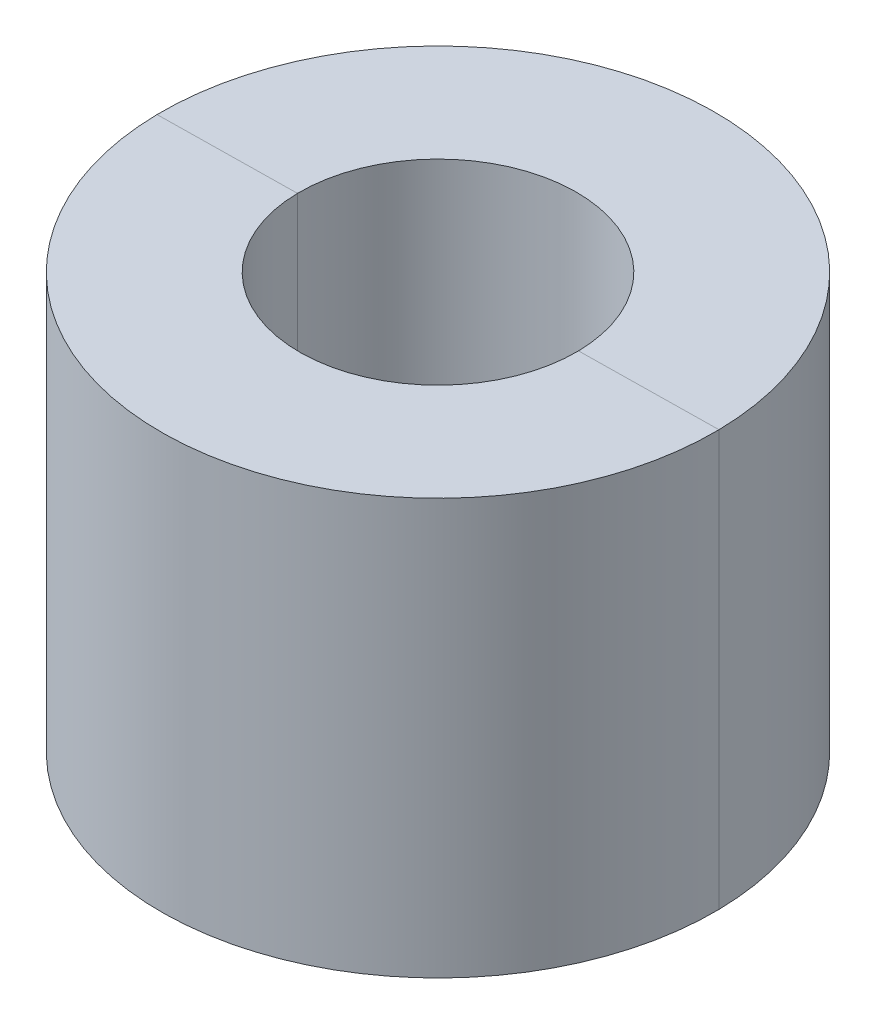
ISO-10303-21;
HEADER;
FILE_DESCRIPTION(('STEP AP214'),'2;1');
FILE_NAME('part.step','',(''),(''),'','','');
FILE_SCHEMA(('AUTOMOTIVE_DESIGN { 1 0 10303 214 1 1 1 1 }'));
ENDSEC;
DATA;
#1=APPLICATION_CONTEXT('core data for automotive mechanical design processes');
#2=APPLICATION_PROTOCOL_DEFINITION('international standard','automotive_design',2000,#1);
#3=PRODUCT_CONTEXT('',#1,'mechanical');
#4=PRODUCT('Part','Part','',(#3));
#5=PRODUCT_RELATED_PRODUCT_CATEGORY('part','',(#4));
#6=PRODUCT_DEFINITION_FORMATION('','',#4);
#7=PRODUCT_DEFINITION_CONTEXT('part definition',#1,'design');
#8=PRODUCT_DEFINITION('design','',#6,#7);
#9=PRODUCT_DEFINITION_SHAPE('','',#8);
#10=(LENGTH_UNIT() NAMED_UNIT(*) SI_UNIT(.MILLI.,.METRE.));
#11=(NAMED_UNIT(*) PLANE_ANGLE_UNIT() SI_UNIT($,.RADIAN.));
#12=(NAMED_UNIT(*) SI_UNIT($,.STERADIAN.) SOLID_ANGLE_UNIT());
#13=UNCERTAINTY_MEASURE_WITH_UNIT(LENGTH_MEASURE(1.E-05),#10,'distance_accuracy_value','');
#14=(GEOMETRIC_REPRESENTATION_CONTEXT(3) GLOBAL_UNCERTAINTY_ASSIGNED_CONTEXT((#13)) GLOBAL_UNIT_ASSIGNED_CONTEXT((#10,
#11,#12)) REPRESENTATION_CONTEXT('',''));
#15=CARTESIAN_POINT('',(0.,0.,0.));
#16=DIRECTION('',(0.,0.,1.));
#17=DIRECTION('',(1.,0.,0.));
#18=AXIS2_PLACEMENT_3D('',#15,#16,#17);
#19=CARTESIAN_POINT('',(-26.5125846974702,-0.00999999999999959,0.38639417159978));
#20=DIRECTION('',(0.0145724435112044,0.,0.999893816307568));
#21=DIRECTION('',(0.999893816307568,0.,-0.0145724435112044));
#22=AXIS2_PLACEMENT_3D('',#19,#20,#21);
#23=PLANE('',#22);
#24=DIRECTION('',(0.999893816307568,0.,-0.0145724435112044));
#25=VECTOR('',#24,1.);
#26=CARTESIAN_POINT('',(0.,30.,0.));
#27=LINE('',#26,#25);
#28=CARTESIAN_POINT('',(-19.9978763261514,30.,0.291448870224088));
#29=VERTEX_POINT('',#28);
#30=CARTESIAN_POINT('',(-9.99893816307568,30.,0.145724435112044));
#31=VERTEX_POINT('',#30);
#32=EDGE_CURVE('E110',#29,#31,#27,.T.);
#33=ORIENTED_EDGE('',*,*,#32,.F.);
#34=DIRECTION('',(0.,-1.,0.));
#35=VECTOR('',#34,1.);
#36=CARTESIAN_POINT('',(-19.9978763261514,30.,0.291448870224087));
#37=LINE('',#36,#35);
#38=CARTESIAN_POINT('',(-19.9978763261514,0.,0.291448870224088));
#39=VERTEX_POINT('',#38);
#40=EDGE_CURVE('E102',#29,#39,#37,.T.);
#41=ORIENTED_EDGE('',*,*,#40,.T.);
#42=DIRECTION('',(0.999893816307568,0.,-0.0145724435112044));
#43=VECTOR('',#42,1.);
#44=CARTESIAN_POINT('',(0.,0.,0.));
#45=LINE('',#44,#43);
#46=CARTESIAN_POINT('',(-9.99893816307568,0.,0.145724435112044));
#47=VERTEX_POINT('',#46);
#48=EDGE_CURVE('E122',#39,#47,#45,.T.);
#49=ORIENTED_EDGE('',*,*,#48,.T.);
#50=DIRECTION('',(0.,-1.,0.));
#51=VECTOR('',#50,1.);
#52=CARTESIAN_POINT('',(-9.99893816307568,30.,0.145724435112044));
#53=LINE('',#52,#51);
#54=EDGE_CURVE('E76',#31,#47,#53,.T.);
#55=ORIENTED_EDGE('',*,*,#54,.F.);
#56=EDGE_LOOP('',(#33,#41,#49,#55));
#57=FACE_BOUND('',#56,.T.);
#58=ADVANCED_FACE('F53',(#57),#23,.T.);
#59=CARTESIAN_POINT('',(9.99893816307568,0.,-0.145724435112044));
#60=VERTEX_POINT('',#59);
#61=CARTESIAN_POINT('',(19.9978763261514,0.,-0.291448870224088));
#62=VERTEX_POINT('',#61);
#63=EDGE_CURVE('E115',#60,#62,#45,.T.);
#64=ORIENTED_EDGE('',*,*,#63,.T.);
#65=DIRECTION('',(0.,-1.,0.));
#66=VECTOR('',#65,1.);
#67=CARTESIAN_POINT('',(19.9978763261514,30.,-0.291448870224087));
#68=LINE('',#67,#66);
#69=CARTESIAN_POINT('',(19.9978763261514,30.,-0.291448870224088));
#70=VERTEX_POINT('',#69);
#71=EDGE_CURVE('E100',#62,#70,#68,.F.);
#72=ORIENTED_EDGE('',*,*,#71,.T.);
#73=CARTESIAN_POINT('',(9.99893816307568,30.,-0.145724435112044));
#74=VERTEX_POINT('',#73);
#75=EDGE_CURVE('E107',#74,#70,#27,.T.);
#76=ORIENTED_EDGE('',*,*,#75,.F.);
#77=DIRECTION('',(0.,-1.,0.));
#78=VECTOR('',#77,1.);
#79=CARTESIAN_POINT('',(9.99893816307568,30.,-0.145724435112044));
#80=LINE('',#79,#78);
#81=EDGE_CURVE('E68',#60,#74,#80,.F.);
#82=ORIENTED_EDGE('',*,*,#81,.F.);
#83=EDGE_LOOP('',(#64,#72,#76,#82));
#84=FACE_BOUND('',#83,.T.);
#85=ADVANCED_FACE('F113',(#84),#23,.T.);
#86=CARTESIAN_POINT('',(0.,0.,0.));
#87=DIRECTION('',(0.,1.,0.));
#88=DIRECTION('',(0.,0.,1.));
#89=AXIS2_PLACEMENT_3D('',#86,#87,#88);
#90=PLANE('',#89);
#91=ORIENTED_EDGE('',*,*,#48,.F.);
#92=CARTESIAN_POINT('',(0.,0.,0.));
#93=DIRECTION('',(0.,1.,0.));
#94=DIRECTION('',(0.,0.,1.));
#95=AXIS2_PLACEMENT_3D('',#92,#93,#94);
#96=CIRCLE('',#95,20.);
#97=EDGE_CURVE('E104',#62,#39,#96,.T.);
#98=ORIENTED_EDGE('',*,*,#97,.F.);
#99=ORIENTED_EDGE('',*,*,#63,.F.);
#100=CARTESIAN_POINT('',(0.,0.,0.));
#101=DIRECTION('',(0.,1.,0.));
#102=DIRECTION('',(1.,0.,0.));
#103=AXIS2_PLACEMENT_3D('',#100,#101,#102);
#104=CIRCLE('',#103,10.);
#105=EDGE_CURVE('E13',#60,#47,#104,.T.);
#106=ORIENTED_EDGE('',*,*,#105,.T.);
#107=EDGE_LOOP('',(#91,#98,#99,#106));
#108=FACE_BOUND('',#107,.T.);
#109=ADVANCED_FACE('F124',(#108),#90,.F.);
#110=CARTESIAN_POINT('',(0.,30.,0.));
#111=DIRECTION('',(0.,1.,0.));
#112=DIRECTION('',(0.,0.,1.));
#113=AXIS2_PLACEMENT_3D('',#110,#111,#112);
#114=PLANE('',#113);
#115=CARTESIAN_POINT('',(0.,30.,0.));
#116=DIRECTION('',(0.,1.,0.));
#117=DIRECTION('',(0.,0.,1.));
#118=AXIS2_PLACEMENT_3D('',#115,#116,#117);
#119=CIRCLE('',#118,20.);
#120=EDGE_CURVE('E96',#70,#29,#119,.T.);
#121=ORIENTED_EDGE('',*,*,#120,.T.);
#122=ORIENTED_EDGE('',*,*,#32,.T.);
#123=CARTESIAN_POINT('',(0.,30.,0.));
#124=DIRECTION('',(0.,1.,0.));
#125=DIRECTION('',(1.,0.,0.));
#126=AXIS2_PLACEMENT_3D('',#123,#124,#125);
#127=CIRCLE('',#126,10.);
#128=EDGE_CURVE('E61',#74,#31,#127,.T.);
#129=ORIENTED_EDGE('',*,*,#128,.F.);
#130=ORIENTED_EDGE('',*,*,#75,.T.);
#131=EDGE_LOOP('',(#121,#122,#129,#130));
#132=FACE_BOUND('',#131,.T.);
#133=ADVANCED_FACE('F108',(#132),#114,.T.);
#134=CARTESIAN_POINT('',(0.,30.,0.));
#135=DIRECTION('',(0.,-1.,0.));
#136=DIRECTION('',(0.,0.,-1.));
#137=AXIS2_PLACEMENT_3D('',#134,#135,#136);
#138=CYLINDRICAL_SURFACE('',#137,10.);
#139=ORIENTED_EDGE('',*,*,#128,.T.);
#140=ORIENTED_EDGE('',*,*,#54,.T.);
#141=ORIENTED_EDGE('',*,*,#105,.F.);
#142=ORIENTED_EDGE('',*,*,#81,.T.);
#143=EDGE_LOOP('',(#139,#140,#141,#142));
#144=FACE_BOUND('',#143,.T.);
#145=ADVANCED_FACE('F55',(#144),#138,.F.);
#146=CARTESIAN_POINT('',(0.,30.,0.));
#147=DIRECTION('',(0.,-1.,0.));
#148=DIRECTION('',(0.,0.,-1.));
#149=AXIS2_PLACEMENT_3D('',#146,#147,#148);
#150=CYLINDRICAL_SURFACE('',#149,20.);
#151=ORIENTED_EDGE('',*,*,#40,.F.);
#152=ORIENTED_EDGE('',*,*,#120,.F.);
#153=ORIENTED_EDGE('',*,*,#71,.F.);
#154=ORIENTED_EDGE('',*,*,#97,.T.);
#155=EDGE_LOOP('',(#151,#152,#153,#154));
#156=FACE_BOUND('',#155,.T.);
#157=ADVANCED_FACE('F98',(#156),#150,.T.);
#158=CLOSED_SHELL('',(#58,#85,#109,#133,#145,#157));
#159=MANIFOLD_SOLID_BREP('B2',#158);
#160=CARTESIAN_POINT('',(-26.5125846974702,-0.00999999999999959,0.38639417159978));
#161=DIRECTION('',(0.0145724435112044,0.,0.999893816307568));
#162=DIRECTION('',(0.999893816307568,0.,-0.0145724435112044));
#163=AXIS2_PLACEMENT_3D('',#160,#161,#162);
#164=PLANE('',#163);
#165=DIRECTION('',(0.999893816307568,0.,-0.0145724435112044));
#166=VECTOR('',#165,1.);
#167=CARTESIAN_POINT('',(0.,30.,0.));
#168=LINE('',#167,#166);
#169=CARTESIAN_POINT('',(-19.9978763261514,30.,0.291448870224088));
#170=VERTEX_POINT('',#169);
#171=CARTESIAN_POINT('',(-9.99893816307568,30.,0.145724435112044));
#172=VERTEX_POINT('',#171);
#173=EDGE_CURVE('E227',#170,#172,#168,.T.);
#174=ORIENTED_EDGE('',*,*,#173,.T.);
#175=DIRECTION('',(0.,-1.,0.));
#176=VECTOR('',#175,1.);
#177=CARTESIAN_POINT('',(-9.99893816307568,30.,0.145724435112044));
#178=LINE('',#177,#176);
#179=CARTESIAN_POINT('',(-9.99893816307568,0.,0.145724435112044));
#180=VERTEX_POINT('',#179);
#181=EDGE_CURVE('E182',#172,#180,#178,.T.);
#182=ORIENTED_EDGE('',*,*,#181,.T.);
#183=DIRECTION('',(0.999893816307568,0.,-0.0145724435112044));
#184=VECTOR('',#183,1.);
#185=CARTESIAN_POINT('',(0.,0.,0.));
#186=LINE('',#185,#184);
#187=CARTESIAN_POINT('',(-19.9978763261514,0.,0.291448870224088));
#188=VERTEX_POINT('',#187);
#189=EDGE_CURVE('E239',#188,#180,#186,.T.);
#190=ORIENTED_EDGE('',*,*,#189,.F.);
#191=DIRECTION('',(0.,-1.,0.));
#192=VECTOR('',#191,1.);
#193=CARTESIAN_POINT('',(-19.9978763261514,30.,0.291448870224087));
#194=LINE('',#193,#192);
#195=EDGE_CURVE('E177',#170,#188,#194,.T.);
#196=ORIENTED_EDGE('',*,*,#195,.F.);
#197=EDGE_LOOP('',(#174,#182,#190,#196));
#198=FACE_BOUND('',#197,.T.);
#199=ADVANCED_FACE('F174',(#198),#164,.F.);
#200=CARTESIAN_POINT('',(9.99893816307568,0.,-0.145724435112044));
#201=VERTEX_POINT('',#200);
#202=CARTESIAN_POINT('',(19.9978763261514,0.,-0.291448870224088));
#203=VERTEX_POINT('',#202);
#204=EDGE_CURVE('E240',#201,#203,#186,.T.);
#205=ORIENTED_EDGE('',*,*,#204,.F.);
#206=DIRECTION('',(0.,-1.,0.));
#207=VECTOR('',#206,1.);
#208=CARTESIAN_POINT('',(9.99893816307568,30.,-0.145724435112044));
#209=LINE('',#208,#207);
#210=CARTESIAN_POINT('',(9.99893816307568,30.,-0.145724435112044));
#211=VERTEX_POINT('',#210);
#212=EDGE_CURVE('E51',#201,#211,#209,.F.);
#213=ORIENTED_EDGE('',*,*,#212,.T.);
#214=CARTESIAN_POINT('',(19.9978763261514,30.,-0.291448870224088));
#215=VERTEX_POINT('',#214);
#216=EDGE_CURVE('E190',#211,#215,#168,.T.);
#217=ORIENTED_EDGE('',*,*,#216,.T.);
#218=DIRECTION('',(0.,-1.,0.));
#219=VECTOR('',#218,1.);
#220=CARTESIAN_POINT('',(19.9978763261514,30.,-0.291448870224087));
#221=LINE('',#220,#219);
#222=EDGE_CURVE('E218',#203,#215,#221,.F.);
#223=ORIENTED_EDGE('',*,*,#222,.F.);
#224=EDGE_LOOP('',(#205,#213,#217,#223));
#225=FACE_BOUND('',#224,.T.);
#226=ADVANCED_FACE('F226',(#225),#164,.F.);
#227=CARTESIAN_POINT('',(0.,30.,0.));
#228=DIRECTION('',(0.,1.,0.));
#229=DIRECTION('',(0.,0.,1.));
#230=AXIS2_PLACEMENT_3D('',#227,#228,#229);
#231=PLANE('',#230);
#232=ORIENTED_EDGE('',*,*,#173,.F.);
#233=CARTESIAN_POINT('',(0.,30.,0.));
#234=DIRECTION('',(0.,1.,0.));
#235=DIRECTION('',(0.,0.,1.));
#236=AXIS2_PLACEMENT_3D('',#233,#234,#235);
#237=CIRCLE('',#236,20.);
#238=EDGE_CURVE('E220',#170,#215,#237,.T.);
#239=ORIENTED_EDGE('',*,*,#238,.T.);
#240=ORIENTED_EDGE('',*,*,#216,.F.);
#241=CARTESIAN_POINT('',(0.,30.,0.));
#242=DIRECTION('',(0.,1.,0.));
#243=DIRECTION('',(1.,0.,0.));
#244=AXIS2_PLACEMENT_3D('',#241,#242,#243);
#245=CIRCLE('',#244,10.);
#246=EDGE_CURVE('E232',#172,#211,#245,.T.);
#247=ORIENTED_EDGE('',*,*,#246,.F.);
#248=EDGE_LOOP('',(#232,#239,#240,#247));
#249=FACE_BOUND('',#248,.T.);
#250=ADVANCED_FACE('F230',(#249),#231,.T.);
#251=CARTESIAN_POINT('',(0.,0.,0.));
#252=DIRECTION('',(0.,1.,0.));
#253=DIRECTION('',(0.,0.,1.));
#254=AXIS2_PLACEMENT_3D('',#251,#252,#253);
#255=PLANE('',#254);
#256=CARTESIAN_POINT('',(0.,0.,0.));
#257=DIRECTION('',(0.,1.,0.));
#258=DIRECTION('',(0.,0.,1.));
#259=AXIS2_PLACEMENT_3D('',#256,#257,#258);
#260=CIRCLE('',#259,20.);
#261=EDGE_CURVE('E222',#188,#203,#260,.T.);
#262=ORIENTED_EDGE('',*,*,#261,.F.);
#263=ORIENTED_EDGE('',*,*,#189,.T.);
#264=CARTESIAN_POINT('',(0.,0.,0.));
#265=DIRECTION('',(0.,1.,0.));
#266=DIRECTION('',(1.,0.,0.));
#267=AXIS2_PLACEMENT_3D('',#264,#265,#266);
#268=CIRCLE('',#267,10.);
#269=EDGE_CURVE('E235',#180,#201,#268,.T.);
#270=ORIENTED_EDGE('',*,*,#269,.T.);
#271=ORIENTED_EDGE('',*,*,#204,.T.);
#272=EDGE_LOOP('',(#262,#263,#270,#271));
#273=FACE_BOUND('',#272,.T.);
#274=ADVANCED_FACE('F245',(#273),#255,.F.);
#275=CARTESIAN_POINT('',(0.,30.,0.));
#276=DIRECTION('',(0.,-1.,0.));
#277=DIRECTION('',(0.,0.,-1.));
#278=AXIS2_PLACEMENT_3D('',#275,#276,#277);
#279=CYLINDRICAL_SURFACE('',#278,20.);
#280=ORIENTED_EDGE('',*,*,#238,.F.);
#281=ORIENTED_EDGE('',*,*,#195,.T.);
#282=ORIENTED_EDGE('',*,*,#261,.T.);
#283=ORIENTED_EDGE('',*,*,#222,.T.);
#284=EDGE_LOOP('',(#280,#281,#282,#283));
#285=FACE_BOUND('',#284,.T.);
#286=ADVANCED_FACE('F219',(#285),#279,.T.);
#287=CARTESIAN_POINT('',(0.,30.,0.));
#288=DIRECTION('',(0.,-1.,0.));
#289=DIRECTION('',(0.,0.,-1.));
#290=AXIS2_PLACEMENT_3D('',#287,#288,#289);
#291=CYLINDRICAL_SURFACE('',#290,10.);
#292=ORIENTED_EDGE('',*,*,#181,.F.);
#293=ORIENTED_EDGE('',*,*,#246,.T.);
#294=ORIENTED_EDGE('',*,*,#212,.F.);
#295=ORIENTED_EDGE('',*,*,#269,.F.);
#296=EDGE_LOOP('',(#292,#293,#294,#295));
#297=FACE_BOUND('',#296,.T.);
#298=ADVANCED_FACE('F252',(#297),#291,.F.);
#299=CLOSED_SHELL('',(#199,#226,#250,#274,#286,#298));
#300=MANIFOLD_SOLID_BREP('B7',#299);
#301=ADVANCED_BREP_SHAPE_REPRESENTATION('',(#18,#159,#300),#14);
#302=SHAPE_DEFINITION_REPRESENTATION(#9,#301);
ENDSEC;
END-ISO-10303-21;
